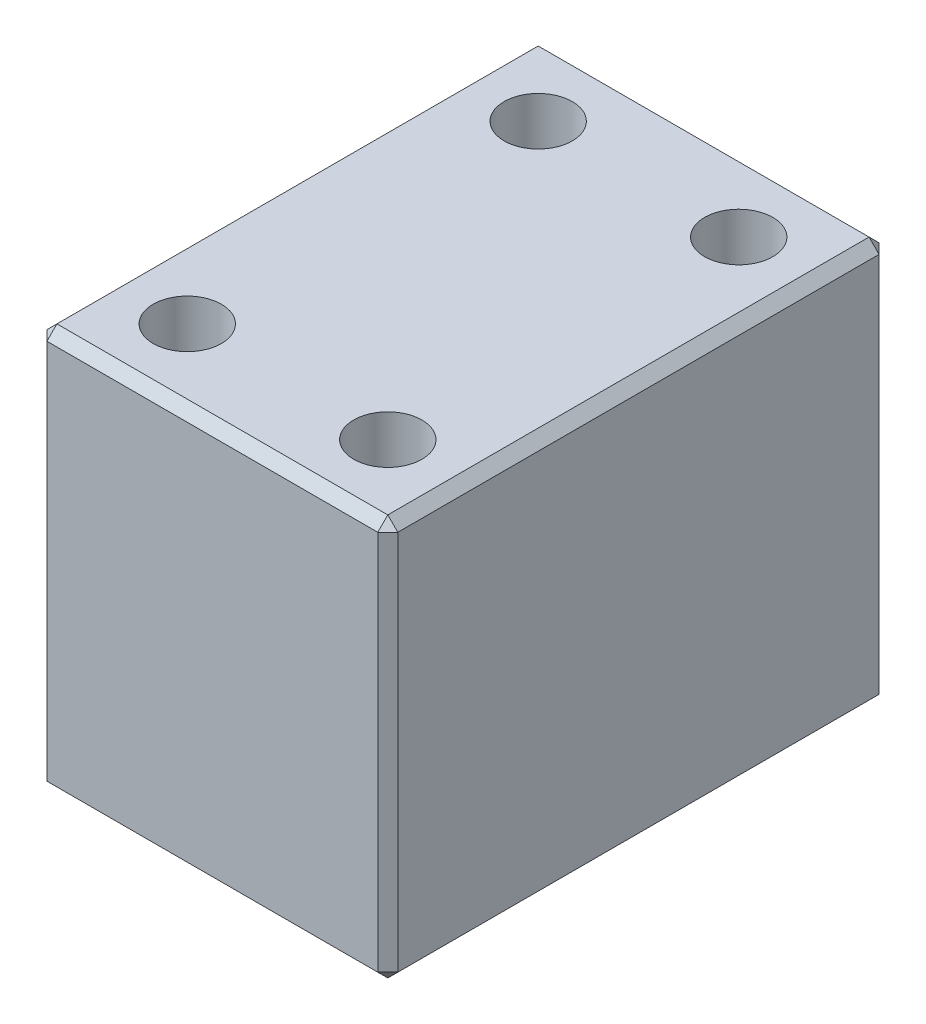
ISO-10303-21;
HEADER;
FILE_DESCRIPTION(('STEP AP214'),'2;1');
FILE_NAME('part.step','',(''),(''),'','','');
FILE_SCHEMA(('AUTOMOTIVE_DESIGN { 1 0 10303 214 1 1 1 1 }'));
ENDSEC;
DATA;
#1=APPLICATION_CONTEXT('core data for automotive mechanical design processes');
#2=APPLICATION_PROTOCOL_DEFINITION('international standard','automotive_design',2000,#1);
#3=PRODUCT_CONTEXT('',#1,'mechanical');
#4=PRODUCT('Part','Part','',(#3));
#5=PRODUCT_RELATED_PRODUCT_CATEGORY('part','',(#4));
#6=PRODUCT_DEFINITION_FORMATION('','',#4);
#7=PRODUCT_DEFINITION_CONTEXT('part definition',#1,'design');
#8=PRODUCT_DEFINITION('design','',#6,#7);
#9=PRODUCT_DEFINITION_SHAPE('','',#8);
#10=(LENGTH_UNIT() NAMED_UNIT(*) SI_UNIT(.MILLI.,.METRE.));
#11=(NAMED_UNIT(*) PLANE_ANGLE_UNIT() SI_UNIT($,.RADIAN.));
#12=(NAMED_UNIT(*) SI_UNIT($,.STERADIAN.) SOLID_ANGLE_UNIT());
#13=UNCERTAINTY_MEASURE_WITH_UNIT(LENGTH_MEASURE(1.E-05),#10,'distance_accuracy_value','');
#14=(GEOMETRIC_REPRESENTATION_CONTEXT(3) GLOBAL_UNCERTAINTY_ASSIGNED_CONTEXT((#13)) GLOBAL_UNIT_ASSIGNED_CONTEXT((#10,
#11,#12)) REPRESENTATION_CONTEXT('',''));
#15=CARTESIAN_POINT('',(0.,0.,0.));
#16=DIRECTION('',(0.,0.,1.));
#17=DIRECTION('',(1.,0.,0.));
#18=AXIS2_PLACEMENT_3D('',#15,#16,#17);
#19=CARTESIAN_POINT('',(17.5,-40.,25.));
#20=DIRECTION('',(1.,0.,0.));
#21=DIRECTION('',(0.,0.,-1.));
#22=AXIS2_PLACEMENT_3D('',#19,#20,#21);
#23=PLANE('',#22);
#24=DIRECTION('',(0.,0.,-1.));
#25=VECTOR('',#24,1.);
#26=CARTESIAN_POINT('',(17.5,-39.,25.));
#27=LINE('',#26,#25);
#28=CARTESIAN_POINT('',(17.5,-39.,24.));
#29=VERTEX_POINT('',#28);
#30=CARTESIAN_POINT('',(17.5,-39.,-24.));
#31=VERTEX_POINT('',#30);
#32=EDGE_CURVE('E63',#29,#31,#27,.T.);
#33=ORIENTED_EDGE('',*,*,#32,.T.);
#34=DIRECTION('',(0.,1.,0.));
#35=VECTOR('',#34,1.);
#36=CARTESIAN_POINT('',(17.5,-40.,-24.));
#37=LINE('',#36,#35);
#38=CARTESIAN_POINT('',(17.5,-1.,-24.));
#39=VERTEX_POINT('',#38);
#40=EDGE_CURVE('E11',#31,#39,#37,.T.);
#41=ORIENTED_EDGE('',*,*,#40,.T.);
#42=DIRECTION('',(0.,0.,1.));
#43=VECTOR('',#42,1.);
#44=CARTESIAN_POINT('',(17.5,-1.,25.));
#45=LINE('',#44,#43);
#46=CARTESIAN_POINT('',(17.5,-1.,24.));
#47=VERTEX_POINT('',#46);
#48=EDGE_CURVE('E232',#39,#47,#45,.T.);
#49=ORIENTED_EDGE('',*,*,#48,.T.);
#50=DIRECTION('',(0.,-1.,0.));
#51=VECTOR('',#50,1.);
#52=CARTESIAN_POINT('',(17.5,-40.,24.));
#53=LINE('',#52,#51);
#54=EDGE_CURVE('E74',#47,#29,#53,.T.);
#55=ORIENTED_EDGE('',*,*,#54,.T.);
#56=EDGE_LOOP('',(#33,#41,#49,#55));
#57=FACE_BOUND('',#56,.T.);
#58=ADVANCED_FACE('F53',(#57),#23,.T.);
#59=CARTESIAN_POINT('',(-17.5,-40.,25.));
#60=DIRECTION('',(0.,0.,1.));
#61=DIRECTION('',(1.,0.,0.));
#62=AXIS2_PLACEMENT_3D('',#59,#60,#61);
#63=PLANE('',#62);
#64=DIRECTION('',(0.,-1.,0.));
#65=VECTOR('',#64,1.);
#66=CARTESIAN_POINT('',(-16.5,-40.,25.));
#67=LINE('',#66,#65);
#68=CARTESIAN_POINT('',(-16.5,-1.,25.));
#69=VERTEX_POINT('',#68);
#70=CARTESIAN_POINT('',(-16.5,-39.,25.));
#71=VERTEX_POINT('',#70);
#72=EDGE_CURVE('E227',#69,#71,#67,.T.);
#73=ORIENTED_EDGE('',*,*,#72,.T.);
#74=DIRECTION('',(1.,0.,0.));
#75=VECTOR('',#74,1.);
#76=CARTESIAN_POINT('',(-17.5,-39.,25.));
#77=LINE('',#76,#75);
#78=CARTESIAN_POINT('',(16.5,-39.,25.));
#79=VERTEX_POINT('',#78);
#80=EDGE_CURVE('E229',#71,#79,#77,.T.);
#81=ORIENTED_EDGE('',*,*,#80,.T.);
#82=DIRECTION('',(0.,1.,0.));
#83=VECTOR('',#82,1.);
#84=CARTESIAN_POINT('',(16.5,-40.,25.));
#85=LINE('',#84,#83);
#86=CARTESIAN_POINT('',(16.5,-1.,25.));
#87=VERTEX_POINT('',#86);
#88=EDGE_CURVE('E223',#79,#87,#85,.T.);
#89=ORIENTED_EDGE('',*,*,#88,.T.);
#90=DIRECTION('',(-1.,0.,0.));
#91=VECTOR('',#90,1.);
#92=CARTESIAN_POINT('',(-17.5,-1.,25.));
#93=LINE('',#92,#91);
#94=EDGE_CURVE('E225',#87,#69,#93,.T.);
#95=ORIENTED_EDGE('',*,*,#94,.T.);
#96=EDGE_LOOP('',(#73,#81,#89,#95));
#97=FACE_BOUND('',#96,.T.);
#98=ADVANCED_FACE('F357',(#97),#63,.T.);
#99=CARTESIAN_POINT('',(-17.5,-40.,25.));
#100=DIRECTION('',(-1.,0.,0.));
#101=DIRECTION('',(0.,0.,1.));
#102=AXIS2_PLACEMENT_3D('',#99,#100,#101);
#103=PLANE('',#102);
#104=DIRECTION('',(0.,-1.,0.));
#105=VECTOR('',#104,1.);
#106=CARTESIAN_POINT('',(-17.5,-40.,-24.));
#107=LINE('',#106,#105);
#108=CARTESIAN_POINT('',(-17.5,-1.,-24.));
#109=VERTEX_POINT('',#108);
#110=CARTESIAN_POINT('',(-17.5,-39.,-24.));
#111=VERTEX_POINT('',#110);
#112=EDGE_CURVE('E218',#109,#111,#107,.T.);
#113=ORIENTED_EDGE('',*,*,#112,.T.);
#114=DIRECTION('',(0.,0.,1.));
#115=VECTOR('',#114,1.);
#116=CARTESIAN_POINT('',(-17.5,-39.,25.));
#117=LINE('',#116,#115);
#118=CARTESIAN_POINT('',(-17.5,-39.,24.));
#119=VERTEX_POINT('',#118);
#120=EDGE_CURVE('E220',#111,#119,#117,.T.);
#121=ORIENTED_EDGE('',*,*,#120,.T.);
#122=DIRECTION('',(0.,1.,0.));
#123=VECTOR('',#122,1.);
#124=CARTESIAN_POINT('',(-17.5,-40.,24.));
#125=LINE('',#124,#123);
#126=CARTESIAN_POINT('',(-17.5,-1.,24.));
#127=VERTEX_POINT('',#126);
#128=EDGE_CURVE('E214',#119,#127,#125,.T.);
#129=ORIENTED_EDGE('',*,*,#128,.T.);
#130=DIRECTION('',(0.,0.,-1.));
#131=VECTOR('',#130,1.);
#132=CARTESIAN_POINT('',(-17.5,-1.,-25.));
#133=LINE('',#132,#131);
#134=EDGE_CURVE('E216',#127,#109,#133,.T.);
#135=ORIENTED_EDGE('',*,*,#134,.T.);
#136=EDGE_LOOP('',(#113,#121,#129,#135));
#137=FACE_BOUND('',#136,.T.);
#138=ADVANCED_FACE('F381',(#137),#103,.T.);
#139=CARTESIAN_POINT('',(-17.5,-40.,-25.));
#140=DIRECTION('',(0.,0.,-1.));
#141=DIRECTION('',(-1.,0.,0.));
#142=AXIS2_PLACEMENT_3D('',#139,#140,#141);
#143=PLANE('',#142);
#144=DIRECTION('',(-1.,0.,0.));
#145=VECTOR('',#144,1.);
#146=CARTESIAN_POINT('',(-17.5,-39.,-25.));
#147=LINE('',#146,#145);
#148=CARTESIAN_POINT('',(16.5,-39.,-25.));
#149=VERTEX_POINT('',#148);
#150=CARTESIAN_POINT('',(-16.5,-39.,-25.));
#151=VERTEX_POINT('',#150);
#152=EDGE_CURVE('E191',#149,#151,#147,.T.);
#153=ORIENTED_EDGE('',*,*,#152,.T.);
#154=DIRECTION('',(0.,1.,0.));
#155=VECTOR('',#154,1.);
#156=CARTESIAN_POINT('',(-16.5,-40.,-25.));
#157=LINE('',#156,#155);
#158=CARTESIAN_POINT('',(-16.5,-1.,-25.));
#159=VERTEX_POINT('',#158);
#160=EDGE_CURVE('E194',#151,#159,#157,.T.);
#161=ORIENTED_EDGE('',*,*,#160,.T.);
#162=DIRECTION('',(1.,0.,0.));
#163=VECTOR('',#162,1.);
#164=CARTESIAN_POINT('',(17.5,-1.,-25.));
#165=LINE('',#164,#163);
#166=CARTESIAN_POINT('',(16.5,-1.,-25.));
#167=VERTEX_POINT('',#166);
#168=EDGE_CURVE('E189',#159,#167,#165,.T.);
#169=ORIENTED_EDGE('',*,*,#168,.T.);
#170=DIRECTION('',(0.,-1.,0.));
#171=VECTOR('',#170,1.);
#172=CARTESIAN_POINT('',(16.5,-40.,-25.));
#173=LINE('',#172,#171);
#174=EDGE_CURVE('E187',#167,#149,#173,.T.);
#175=ORIENTED_EDGE('',*,*,#174,.T.);
#176=EDGE_LOOP('',(#153,#161,#169,#175));
#177=FACE_BOUND('',#176,.T.);
#178=ADVANCED_FACE('F379',(#177),#143,.T.);
#179=CARTESIAN_POINT('',(0.,-40.,0.));
#180=DIRECTION('',(0.,-1.,0.));
#181=DIRECTION('',(0.,0.,-1.));
#182=AXIS2_PLACEMENT_3D('',#179,#180,#181);
#183=PLANE('',#182);
#184=DIRECTION('',(0.,0.,-1.));
#185=VECTOR('',#184,1.);
#186=CARTESIAN_POINT('',(-16.5,-40.,0.));
#187=LINE('',#186,#185);
#188=CARTESIAN_POINT('',(-16.5,-40.,24.));
#189=VERTEX_POINT('',#188);
#190=CARTESIAN_POINT('',(-16.5,-40.,-24.));
#191=VERTEX_POINT('',#190);
#192=EDGE_CURVE('E200',#189,#191,#187,.T.);
#193=ORIENTED_EDGE('',*,*,#192,.T.);
#194=DIRECTION('',(1.,0.,0.));
#195=VECTOR('',#194,1.);
#196=CARTESIAN_POINT('',(0.,-40.,-24.));
#197=LINE('',#196,#195);
#198=CARTESIAN_POINT('',(16.5,-40.,-24.));
#199=VERTEX_POINT('',#198);
#200=EDGE_CURVE('E202',#191,#199,#197,.T.);
#201=ORIENTED_EDGE('',*,*,#200,.T.);
#202=DIRECTION('',(0.,0.,1.));
#203=VECTOR('',#202,1.);
#204=CARTESIAN_POINT('',(16.5,-40.,0.));
#205=LINE('',#204,#203);
#206=CARTESIAN_POINT('',(16.5,-40.,24.));
#207=VERTEX_POINT('',#206);
#208=EDGE_CURVE('E196',#199,#207,#205,.T.);
#209=ORIENTED_EDGE('',*,*,#208,.T.);
#210=DIRECTION('',(-1.,0.,0.));
#211=VECTOR('',#210,1.);
#212=CARTESIAN_POINT('',(0.,-40.,24.));
#213=LINE('',#212,#211);
#214=EDGE_CURVE('E198',#207,#189,#213,.T.);
#215=ORIENTED_EDGE('',*,*,#214,.T.);
#216=EDGE_LOOP('',(#193,#201,#209,#215));
#217=FACE_BOUND('',#216,.T.);
#218=ADVANCED_FACE('F364',(#217),#183,.T.);
#219=CARTESIAN_POINT('',(0.,0.,0.));
#220=DIRECTION('',(0.,-1.,0.));
#221=DIRECTION('',(0.,0.,-1.));
#222=AXIS2_PLACEMENT_3D('',#219,#220,#221);
#223=PLANE('',#222);
#224=CARTESIAN_POINT('',(-10.,0.,17.5));
#225=DIRECTION('',(0.,1.,0.));
#226=DIRECTION('',(0.,0.,1.));
#227=AXIS2_PLACEMENT_3D('',#224,#225,#226);
#228=CIRCLE('',#227,3.39999999999999);
#229=CARTESIAN_POINT('',(-10.,0.,20.9));
#230=VERTEX_POINT('',#229);
#231=EDGE_CURVE('E164',#230,#230,#228,.T.);
#232=ORIENTED_EDGE('',*,*,#231,.F.);
#233=EDGE_LOOP('',(#232));
#234=FACE_BOUND('',#233,.T.);
#235=CARTESIAN_POINT('',(10.,0.,-17.5));
#236=DIRECTION('',(0.,1.,0.));
#237=DIRECTION('',(0.,0.,1.));
#238=AXIS2_PLACEMENT_3D('',#235,#236,#237);
#239=CIRCLE('',#238,3.39999999999999);
#240=CARTESIAN_POINT('',(10.,0.,-14.1));
#241=VERTEX_POINT('',#240);
#242=EDGE_CURVE('E163',#241,#241,#239,.T.);
#243=ORIENTED_EDGE('',*,*,#242,.F.);
#244=EDGE_LOOP('',(#243));
#245=FACE_BOUND('',#244,.T.);
#246=CARTESIAN_POINT('',(-10.,0.,-17.5));
#247=DIRECTION('',(0.,1.,0.));
#248=DIRECTION('',(0.,0.,1.));
#249=AXIS2_PLACEMENT_3D('',#246,#247,#248);
#250=CIRCLE('',#249,3.39999999999999);
#251=CARTESIAN_POINT('',(-10.,0.,-14.1));
#252=VERTEX_POINT('',#251);
#253=EDGE_CURVE('E174',#252,#252,#250,.T.);
#254=ORIENTED_EDGE('',*,*,#253,.F.);
#255=EDGE_LOOP('',(#254));
#256=FACE_BOUND('',#255,.T.);
#257=CARTESIAN_POINT('',(10.,0.,17.5));
#258=DIRECTION('',(0.,1.,0.));
#259=DIRECTION('',(0.,0.,1.));
#260=AXIS2_PLACEMENT_3D('',#257,#258,#259);
#261=CIRCLE('',#260,3.39999999999999);
#262=CARTESIAN_POINT('',(10.,0.,20.9));
#263=VERTEX_POINT('',#262);
#264=EDGE_CURVE('E180',#263,#263,#261,.T.);
#265=ORIENTED_EDGE('',*,*,#264,.F.);
#266=EDGE_LOOP('',(#265));
#267=FACE_BOUND('',#266,.T.);
#268=DIRECTION('',(0.,0.,-1.));
#269=VECTOR('',#268,1.);
#270=CARTESIAN_POINT('',(16.5,0.,-25.));
#271=LINE('',#270,#269);
#272=CARTESIAN_POINT('',(16.5,0.,24.));
#273=VERTEX_POINT('',#272);
#274=CARTESIAN_POINT('',(16.5,0.,-24.));
#275=VERTEX_POINT('',#274);
#276=EDGE_CURVE('E205',#273,#275,#271,.T.);
#277=ORIENTED_EDGE('',*,*,#276,.T.);
#278=DIRECTION('',(-1.,0.,0.));
#279=VECTOR('',#278,1.);
#280=CARTESIAN_POINT('',(-17.5,0.,-24.));
#281=LINE('',#280,#279);
#282=CARTESIAN_POINT('',(-16.5,0.,-24.));
#283=VERTEX_POINT('',#282);
#284=EDGE_CURVE('E211',#275,#283,#281,.T.);
#285=ORIENTED_EDGE('',*,*,#284,.T.);
#286=DIRECTION('',(0.,0.,1.));
#287=VECTOR('',#286,1.);
#288=CARTESIAN_POINT('',(-16.5,0.,25.));
#289=LINE('',#288,#287);
#290=CARTESIAN_POINT('',(-16.5,0.,24.));
#291=VERTEX_POINT('',#290);
#292=EDGE_CURVE('E209',#283,#291,#289,.T.);
#293=ORIENTED_EDGE('',*,*,#292,.T.);
#294=DIRECTION('',(1.,0.,0.));
#295=VECTOR('',#294,1.);
#296=CARTESIAN_POINT('',(17.5,0.,24.));
#297=LINE('',#296,#295);
#298=EDGE_CURVE('E207',#291,#273,#297,.T.);
#299=ORIENTED_EDGE('',*,*,#298,.T.);
#300=EDGE_LOOP('',(#277,#285,#293,#299));
#301=FACE_BOUND('',#300,.T.);
#302=ADVANCED_FACE('F336',(#234,#245,#256,#267,#301),#223,.F.);
#303=CARTESIAN_POINT('',(0.,0.,24.));
#304=DIRECTION('',(0.,0.707106781186545,0.70710678118655));
#305=DIRECTION('',(-1.,0.,0.));
#306=AXIS2_PLACEMENT_3D('',#303,#304,#305);
#307=PLANE('',#306);
#308=DIRECTION('',(0.,-0.70710678118655,0.707106781186545));
#309=VECTOR('',#308,1.);
#310=CARTESIAN_POINT('',(16.5,0.,24.));
#311=LINE('',#310,#309);
#312=EDGE_CURVE('E58',#273,#87,#311,.T.);
#313=ORIENTED_EDGE('',*,*,#312,.F.);
#314=ORIENTED_EDGE('',*,*,#298,.F.);
#315=DIRECTION('',(0.,0.70710678118655,-0.707106781186545));
#316=VECTOR('',#315,1.);
#317=CARTESIAN_POINT('',(-16.5,0.,24.));
#318=LINE('',#317,#316);
#319=EDGE_CURVE('E294',#69,#291,#318,.T.);
#320=ORIENTED_EDGE('',*,*,#319,.F.);
#321=ORIENTED_EDGE('',*,*,#94,.F.);
#322=EDGE_LOOP('',(#313,#314,#320,#321));
#323=FACE_BOUND('',#322,.T.);
#324=ADVANCED_FACE('F56',(#323),#307,.T.);
#325=CARTESIAN_POINT('',(16.5,0.,24.));
#326=DIRECTION('',(0.57735026918963,0.577350269189622,0.577350269189626));
#327=DIRECTION('',(0.707106781186545,0.,-0.70710678118655));
#328=AXIS2_PLACEMENT_3D('',#325,#326,#327);
#329=PLANE('',#328);
#330=DIRECTION('',(-0.707106781186545,0.70710678118655,0.));
#331=VECTOR('',#330,1.);
#332=CARTESIAN_POINT('',(16.5,0.,24.));
#333=LINE('',#332,#331);
#334=EDGE_CURVE('E289',#273,#47,#333,.F.);
#335=ORIENTED_EDGE('',*,*,#334,.F.);
#336=ORIENTED_EDGE('',*,*,#312,.T.);
#337=DIRECTION('',(-0.707106781186545,0.,0.70710678118655));
#338=VECTOR('',#337,1.);
#339=CARTESIAN_POINT('',(17.,-1.,24.5));
#340=LINE('',#339,#338);
#341=EDGE_CURVE('E292',#47,#87,#340,.T.);
#342=ORIENTED_EDGE('',*,*,#341,.F.);
#343=EDGE_LOOP('',(#335,#336,#342));
#344=FACE_BOUND('',#343,.T.);
#345=ADVANCED_FACE('F305',(#344),#329,.T.);
#346=CARTESIAN_POINT('',(-16.5,0.,24.));
#347=DIRECTION('',(-0.577350269189626,0.577350269189622,0.57735026918963));
#348=DIRECTION('',(0.70710678118655,0.,0.707106781186545));
#349=AXIS2_PLACEMENT_3D('',#346,#347,#348);
#350=PLANE('',#349);
#351=DIRECTION('',(-0.70710678118655,0.,-0.707106781186545));
#352=VECTOR('',#351,1.);
#353=CARTESIAN_POINT('',(-17.,-1.,24.5));
#354=LINE('',#353,#352);
#355=EDGE_CURVE('E283',#69,#127,#354,.T.);
#356=ORIENTED_EDGE('',*,*,#355,.F.);
#357=ORIENTED_EDGE('',*,*,#319,.T.);
#358=DIRECTION('',(-0.707106781186545,-0.70710678118655,0.));
#359=VECTOR('',#358,1.);
#360=CARTESIAN_POINT('',(-16.5,0.,24.));
#361=LINE('',#360,#359);
#362=EDGE_CURVE('E286',#127,#291,#361,.F.);
#363=ORIENTED_EDGE('',*,*,#362,.F.);
#364=EDGE_LOOP('',(#356,#357,#363));
#365=FACE_BOUND('',#364,.T.);
#366=ADVANCED_FACE('F350',(#365),#350,.T.);
#367=CARTESIAN_POINT('',(16.5,-40.,25.));
#368=DIRECTION('',(-0.70710678118655,0.,-0.707106781186545));
#369=DIRECTION('',(0.,1.,0.));
#370=AXIS2_PLACEMENT_3D('',#367,#368,#369);
#371=PLANE('',#370);
#372=ORIENTED_EDGE('',*,*,#341,.T.);
#373=ORIENTED_EDGE('',*,*,#88,.F.);
#374=DIRECTION('',(0.707106781186545,0.,-0.70710678118655));
#375=VECTOR('',#374,1.);
#376=CARTESIAN_POINT('',(16.5,-39.,25.));
#377=LINE('',#376,#375);
#378=EDGE_CURVE('E278',#29,#79,#377,.F.);
#379=ORIENTED_EDGE('',*,*,#378,.F.);
#380=ORIENTED_EDGE('',*,*,#54,.F.);
#381=EDGE_LOOP('',(#372,#373,#379,#380));
#382=FACE_BOUND('',#381,.T.);
#383=ADVANCED_FACE('F312',(#382),#371,.F.);
#384=CARTESIAN_POINT('',(16.5,0.,0.));
#385=DIRECTION('',(0.70710678118655,0.707106781186545,0.));
#386=DIRECTION('',(0.,0.,1.));
#387=AXIS2_PLACEMENT_3D('',#384,#385,#386);
#388=PLANE('',#387);
#389=ORIENTED_EDGE('',*,*,#334,.T.);
#390=ORIENTED_EDGE('',*,*,#48,.F.);
#391=DIRECTION('',(0.707106781186545,-0.70710678118655,0.));
#392=VECTOR('',#391,1.);
#393=CARTESIAN_POINT('',(17.,-0.5,-24.));
#394=LINE('',#393,#392);
#395=EDGE_CURVE('E275',#275,#39,#394,.T.);
#396=ORIENTED_EDGE('',*,*,#395,.F.);
#397=ORIENTED_EDGE('',*,*,#276,.F.);
#398=EDGE_LOOP('',(#389,#390,#396,#397));
#399=FACE_BOUND('',#398,.T.);
#400=ADVANCED_FACE('F333',(#399),#388,.T.);
#401=CARTESIAN_POINT('',(0.,0.,-24.));
#402=DIRECTION('',(0.,0.707106781186545,-0.70710678118655));
#403=DIRECTION('',(1.,0.,0.));
#404=AXIS2_PLACEMENT_3D('',#401,#402,#403);
#405=PLANE('',#404);
#406=DIRECTION('',(0.,-0.70710678118655,-0.707106781186545));
#407=VECTOR('',#406,1.);
#408=CARTESIAN_POINT('',(-16.5,0.,-24.));
#409=LINE('',#408,#407);
#410=EDGE_CURVE('E269',#283,#159,#409,.T.);
#411=ORIENTED_EDGE('',*,*,#410,.F.);
#412=ORIENTED_EDGE('',*,*,#284,.F.);
#413=DIRECTION('',(0.,0.70710678118655,0.707106781186545));
#414=VECTOR('',#413,1.);
#415=CARTESIAN_POINT('',(16.5,-1.,-25.));
#416=LINE('',#415,#414);
#417=EDGE_CURVE('E272',#167,#275,#416,.T.);
#418=ORIENTED_EDGE('',*,*,#417,.F.);
#419=ORIENTED_EDGE('',*,*,#168,.F.);
#420=EDGE_LOOP('',(#411,#412,#418,#419));
#421=FACE_BOUND('',#420,.T.);
#422=ADVANCED_FACE('F340',(#421),#405,.T.);
#423=CARTESIAN_POINT('',(-16.5,0.,0.));
#424=DIRECTION('',(-0.70710678118655,0.707106781186545,0.));
#425=DIRECTION('',(0.,0.,-1.));
#426=AXIS2_PLACEMENT_3D('',#423,#424,#425);
#427=PLANE('',#426);
#428=ORIENTED_EDGE('',*,*,#362,.T.);
#429=ORIENTED_EDGE('',*,*,#292,.F.);
#430=DIRECTION('',(0.707106781186545,0.70710678118655,0.));
#431=VECTOR('',#430,1.);
#432=CARTESIAN_POINT('',(-16.5,0.,-24.));
#433=LINE('',#432,#431);
#434=EDGE_CURVE('E267',#109,#283,#433,.T.);
#435=ORIENTED_EDGE('',*,*,#434,.F.);
#436=ORIENTED_EDGE('',*,*,#134,.F.);
#437=EDGE_LOOP('',(#428,#429,#435,#436));
#438=FACE_BOUND('',#437,.T.);
#439=ADVANCED_FACE('F347',(#438),#427,.T.);
#440=CARTESIAN_POINT('',(-17.5,-40.,24.));
#441=DIRECTION('',(0.707106781186545,0.,-0.70710678118655));
#442=DIRECTION('',(0.,1.,0.));
#443=AXIS2_PLACEMENT_3D('',#440,#441,#442);
#444=PLANE('',#443);
#445=ORIENTED_EDGE('',*,*,#355,.T.);
#446=ORIENTED_EDGE('',*,*,#128,.F.);
#447=DIRECTION('',(0.70710678118655,0.,0.707106781186545));
#448=VECTOR('',#447,1.);
#449=CARTESIAN_POINT('',(-17.5,-39.,24.));
#450=LINE('',#449,#448);
#451=EDGE_CURVE('E264',#71,#119,#450,.F.);
#452=ORIENTED_EDGE('',*,*,#451,.F.);
#453=ORIENTED_EDGE('',*,*,#72,.F.);
#454=EDGE_LOOP('',(#445,#446,#452,#453));
#455=FACE_BOUND('',#454,.T.);
#456=ADVANCED_FACE('F354',(#455),#444,.F.);
#457=CARTESIAN_POINT('',(-17.5,-39.,25.));
#458=DIRECTION('',(0.,0.70710678118655,-0.707106781186545));
#459=DIRECTION('',(1.,0.,0.));
#460=AXIS2_PLACEMENT_3D('',#457,#458,#459);
#461=PLANE('',#460);
#462=DIRECTION('',(0.,0.707106781186545,0.70710678118655));
#463=VECTOR('',#462,1.);
#464=CARTESIAN_POINT('',(16.5,-39.,25.));
#465=LINE('',#464,#463);
#466=EDGE_CURVE('E280',#79,#207,#465,.F.);
#467=ORIENTED_EDGE('',*,*,#466,.F.);
#468=ORIENTED_EDGE('',*,*,#80,.F.);
#469=DIRECTION('',(0.,-0.707106781186545,-0.70710678118655));
#470=VECTOR('',#469,1.);
#471=CARTESIAN_POINT('',(-16.5,-39.5,24.5));
#472=LINE('',#471,#470);
#473=EDGE_CURVE('E261',#189,#71,#472,.F.);
#474=ORIENTED_EDGE('',*,*,#473,.F.);
#475=ORIENTED_EDGE('',*,*,#214,.F.);
#476=EDGE_LOOP('',(#467,#468,#474,#475));
#477=FACE_BOUND('',#476,.T.);
#478=ADVANCED_FACE('F360',(#477),#461,.F.);
#479=CARTESIAN_POINT('',(16.5,-39.,25.));
#480=DIRECTION('',(0.57735026918963,-0.577350269189626,0.577350269189622));
#481=DIRECTION('',(0.707106781186545,0.70710678118655,0.));
#482=AXIS2_PLACEMENT_3D('',#479,#480,#481);
#483=PLANE('',#482);
#484=ORIENTED_EDGE('',*,*,#378,.T.);
#485=ORIENTED_EDGE('',*,*,#466,.T.);
#486=DIRECTION('',(-0.707106781186545,-0.70710678118655,0.));
#487=VECTOR('',#486,1.);
#488=CARTESIAN_POINT('',(17.,-39.5,24.));
#489=LINE('',#488,#487);
#490=EDGE_CURVE('E258',#29,#207,#489,.T.);
#491=ORIENTED_EDGE('',*,*,#490,.F.);
#492=EDGE_LOOP('',(#484,#485,#491));
#493=FACE_BOUND('',#492,.T.);
#494=ADVANCED_FACE('F316',(#493),#483,.T.);
#495=CARTESIAN_POINT('',(16.5,-1.,-25.));
#496=DIRECTION('',(0.57735026918963,0.577350269189622,-0.577350269189626));
#497=DIRECTION('',(-0.707106781186545,0.,-0.70710678118655));
#498=AXIS2_PLACEMENT_3D('',#495,#496,#497);
#499=PLANE('',#498);
#500=ORIENTED_EDGE('',*,*,#417,.T.);
#501=ORIENTED_EDGE('',*,*,#395,.T.);
#502=DIRECTION('',(0.707106781186545,0.,0.70710678118655));
#503=VECTOR('',#502,1.);
#504=CARTESIAN_POINT('',(16.5,-1.,-25.));
#505=LINE('',#504,#503);
#506=EDGE_CURVE('E256',#167,#39,#505,.T.);
#507=ORIENTED_EDGE('',*,*,#506,.F.);
#508=EDGE_LOOP('',(#500,#501,#507));
#509=FACE_BOUND('',#508,.T.);
#510=ADVANCED_FACE('F449',(#509),#499,.T.);
#511=CARTESIAN_POINT('',(-16.5,0.,-24.));
#512=DIRECTION('',(-0.57735026918963,0.577350269189622,-0.577350269189626));
#513=DIRECTION('',(-0.707106781186545,0.,0.70710678118655));
#514=AXIS2_PLACEMENT_3D('',#511,#512,#513);
#515=PLANE('',#514);
#516=ORIENTED_EDGE('',*,*,#434,.T.);
#517=ORIENTED_EDGE('',*,*,#410,.T.);
#518=DIRECTION('',(0.707106781186545,0.,-0.70710678118655));
#519=VECTOR('',#518,1.);
#520=CARTESIAN_POINT('',(-17.,-1.,-24.5));
#521=LINE('',#520,#519);
#522=EDGE_CURVE('E253',#109,#159,#521,.T.);
#523=ORIENTED_EDGE('',*,*,#522,.F.);
#524=EDGE_LOOP('',(#516,#517,#523));
#525=FACE_BOUND('',#524,.T.);
#526=ADVANCED_FACE('F442',(#525),#515,.T.);
#527=CARTESIAN_POINT('',(-17.5,-39.,24.));
#528=DIRECTION('',(-0.577350269189622,-0.57735026918963,0.577350269189626));
#529=DIRECTION('',(0.,-0.707106781186545,-0.70710678118655));
#530=AXIS2_PLACEMENT_3D('',#527,#528,#529);
#531=PLANE('',#530);
#532=ORIENTED_EDGE('',*,*,#473,.T.);
#533=ORIENTED_EDGE('',*,*,#451,.T.);
#534=DIRECTION('',(-0.70710678118655,0.707106781186545,0.));
#535=VECTOR('',#534,1.);
#536=CARTESIAN_POINT('',(-17.5,-39.,24.));
#537=LINE('',#536,#535);
#538=EDGE_CURVE('E251',#189,#119,#537,.T.);
#539=ORIENTED_EDGE('',*,*,#538,.F.);
#540=EDGE_LOOP('',(#532,#533,#539));
#541=FACE_BOUND('',#540,.T.);
#542=ADVANCED_FACE('F436',(#541),#531,.T.);
#543=CARTESIAN_POINT('',(17.5,-39.,25.));
#544=DIRECTION('',(-0.70710678118655,0.707106781186545,0.));
#545=DIRECTION('',(0.,0.,-1.));
#546=AXIS2_PLACEMENT_3D('',#543,#544,#545);
#547=PLANE('',#546);
#548=ORIENTED_EDGE('',*,*,#490,.T.);
#549=ORIENTED_EDGE('',*,*,#208,.F.);
#550=DIRECTION('',(0.707106781186545,0.70710678118655,0.));
#551=VECTOR('',#550,1.);
#552=CARTESIAN_POINT('',(16.5,-40.,-24.));
#553=LINE('',#552,#551);
#554=EDGE_CURVE('E248',#31,#199,#553,.F.);
#555=ORIENTED_EDGE('',*,*,#554,.F.);
#556=ORIENTED_EDGE('',*,*,#32,.F.);
#557=EDGE_LOOP('',(#548,#549,#555,#556));
#558=FACE_BOUND('',#557,.T.);
#559=ADVANCED_FACE('F320',(#558),#547,.F.);
#560=CARTESIAN_POINT('',(17.5,-40.,-24.));
#561=DIRECTION('',(-0.70710678118655,0.,0.707106781186545));
#562=DIRECTION('',(0.,1.,0.));
#563=AXIS2_PLACEMENT_3D('',#560,#561,#562);
#564=PLANE('',#563);
#565=ORIENTED_EDGE('',*,*,#506,.T.);
#566=ORIENTED_EDGE('',*,*,#40,.F.);
#567=DIRECTION('',(-0.707106781186545,0.,-0.70710678118655));
#568=VECTOR('',#567,1.);
#569=CARTESIAN_POINT('',(17.,-39.,-24.5));
#570=LINE('',#569,#568);
#571=EDGE_CURVE('E245',#149,#31,#570,.F.);
#572=ORIENTED_EDGE('',*,*,#571,.F.);
#573=ORIENTED_EDGE('',*,*,#174,.F.);
#574=EDGE_LOOP('',(#565,#566,#572,#573));
#575=FACE_BOUND('',#574,.T.);
#576=ADVANCED_FACE('F328',(#575),#564,.F.);
#577=CARTESIAN_POINT('',(-16.5,-40.,-25.));
#578=DIRECTION('',(0.70710678118655,0.,0.707106781186545));
#579=DIRECTION('',(0.,1.,0.));
#580=AXIS2_PLACEMENT_3D('',#577,#578,#579);
#581=PLANE('',#580);
#582=ORIENTED_EDGE('',*,*,#522,.T.);
#583=ORIENTED_EDGE('',*,*,#160,.F.);
#584=DIRECTION('',(-0.707106781186545,0.,0.70710678118655));
#585=VECTOR('',#584,1.);
#586=CARTESIAN_POINT('',(-16.5,-39.,-25.));
#587=LINE('',#586,#585);
#588=EDGE_CURVE('E242',#111,#151,#587,.F.);
#589=ORIENTED_EDGE('',*,*,#588,.F.);
#590=ORIENTED_EDGE('',*,*,#112,.F.);
#591=EDGE_LOOP('',(#582,#583,#589,#590));
#592=FACE_BOUND('',#591,.T.);
#593=ADVANCED_FACE('F377',(#592),#581,.F.);
#594=CARTESIAN_POINT('',(-17.5,-39.,25.));
#595=DIRECTION('',(0.707106781186545,0.70710678118655,0.));
#596=DIRECTION('',(0.,0.,1.));
#597=AXIS2_PLACEMENT_3D('',#594,#595,#596);
#598=PLANE('',#597);
#599=ORIENTED_EDGE('',*,*,#538,.T.);
#600=ORIENTED_EDGE('',*,*,#120,.F.);
#601=DIRECTION('',(0.70710678118655,-0.707106781186545,0.));
#602=VECTOR('',#601,1.);
#603=CARTESIAN_POINT('',(-17.,-39.5,-24.));
#604=LINE('',#603,#602);
#605=EDGE_CURVE('E239',#191,#111,#604,.F.);
#606=ORIENTED_EDGE('',*,*,#605,.F.);
#607=ORIENTED_EDGE('',*,*,#192,.F.);
#608=EDGE_LOOP('',(#599,#600,#606,#607));
#609=FACE_BOUND('',#608,.T.);
#610=ADVANCED_FACE('F414',(#609),#598,.F.);
#611=CARTESIAN_POINT('',(16.5,-40.,-24.));
#612=DIRECTION('',(0.57735026918963,-0.577350269189626,-0.577350269189622));
#613=DIRECTION('',(0.707106781186545,0.70710678118655,0.));
#614=AXIS2_PLACEMENT_3D('',#611,#612,#613);
#615=PLANE('',#614);
#616=ORIENTED_EDGE('',*,*,#571,.T.);
#617=ORIENTED_EDGE('',*,*,#554,.T.);
#618=DIRECTION('',(0.,-0.707106781186545,0.70710678118655));
#619=VECTOR('',#618,1.);
#620=CARTESIAN_POINT('',(16.5,-40.,-24.));
#621=LINE('',#620,#619);
#622=EDGE_CURVE('E237',#149,#199,#621,.T.);
#623=ORIENTED_EDGE('',*,*,#622,.F.);
#624=EDGE_LOOP('',(#616,#617,#623));
#625=FACE_BOUND('',#624,.T.);
#626=ADVANCED_FACE('F324',(#625),#615,.T.);
#627=CARTESIAN_POINT('',(-16.5,-39.,-25.));
#628=DIRECTION('',(-0.577350269189626,-0.57735026918963,-0.577350269189622));
#629=DIRECTION('',(0.70710678118655,-0.707106781186545,0.));
#630=AXIS2_PLACEMENT_3D('',#627,#628,#629);
#631=PLANE('',#630);
#632=ORIENTED_EDGE('',*,*,#605,.T.);
#633=ORIENTED_EDGE('',*,*,#588,.T.);
#634=DIRECTION('',(0.,0.707106781186545,-0.70710678118655));
#635=VECTOR('',#634,1.);
#636=CARTESIAN_POINT('',(-16.5,-39.,-25.));
#637=LINE('',#636,#635);
#638=EDGE_CURVE('E186',#191,#151,#637,.T.);
#639=ORIENTED_EDGE('',*,*,#638,.F.);
#640=EDGE_LOOP('',(#632,#633,#639));
#641=FACE_BOUND('',#640,.T.);
#642=ADVANCED_FACE('F372',(#641),#631,.T.);
#643=CARTESIAN_POINT('',(-17.5,-39.,-25.));
#644=DIRECTION('',(0.,0.70710678118655,0.707106781186545));
#645=DIRECTION('',(-1.,0.,0.));
#646=AXIS2_PLACEMENT_3D('',#643,#644,#645);
#647=PLANE('',#646);
#648=ORIENTED_EDGE('',*,*,#622,.T.);
#649=ORIENTED_EDGE('',*,*,#200,.F.);
#650=ORIENTED_EDGE('',*,*,#638,.T.);
#651=ORIENTED_EDGE('',*,*,#152,.F.);
#652=EDGE_LOOP('',(#648,#649,#650,#651));
#653=FACE_BOUND('',#652,.T.);
#654=ADVANCED_FACE('F370',(#653),#647,.F.);
#655=CARTESIAN_POINT('',(10.,-19.75,17.5));
#656=DIRECTION('',(0.,1.,0.));
#657=DIRECTION('',(0.,0.,1.));
#658=AXIS2_PLACEMENT_3D('',#655,#656,#657);
#659=CONICAL_SURFACE('',#658,3.39999999999999,1.02974425867665);
#660=CARTESIAN_POINT('',(10.,-21.7929261046937,17.5));
#661=VERTEX_POINT('',#660);
#662=VERTEX_LOOP('',#661);
#663=FACE_BOUND('',#662,.T.);
#664=CARTESIAN_POINT('',(10.,-19.75,17.5));
#665=DIRECTION('',(0.,1.,0.));
#666=DIRECTION('',(0.,0.,1.));
#667=AXIS2_PLACEMENT_3D('',#664,#665,#666);
#668=CIRCLE('',#667,3.39999999999999);
#669=CARTESIAN_POINT('',(10.,-19.75,20.9));
#670=VERTEX_POINT('',#669);
#671=EDGE_CURVE('E183',#670,#670,#668,.T.);
#672=ORIENTED_EDGE('',*,*,#671,.T.);
#673=EDGE_LOOP('',(#672));
#674=FACE_BOUND('',#673,.T.);
#675=ADVANCED_FACE('F403',(#663,#674),#659,.F.);
#676=CARTESIAN_POINT('',(10.,0.,17.5));
#677=DIRECTION('',(0.,1.,0.));
#678=DIRECTION('',(0.,0.,1.));
#679=AXIS2_PLACEMENT_3D('',#676,#677,#678);
#680=CYLINDRICAL_SURFACE('',#679,3.39999999999999);
#681=ORIENTED_EDGE('',*,*,#671,.F.);
#682=EDGE_LOOP('',(#681));
#683=FACE_BOUND('',#682,.T.);
#684=ORIENTED_EDGE('',*,*,#264,.T.);
#685=EDGE_LOOP('',(#684));
#686=FACE_BOUND('',#685,.T.);
#687=ADVANCED_FACE('F515',(#683,#686),#680,.F.);
#688=CARTESIAN_POINT('',(-10.,-19.75,-17.5));
#689=DIRECTION('',(0.,1.,0.));
#690=DIRECTION('',(0.,0.,1.));
#691=AXIS2_PLACEMENT_3D('',#688,#689,#690);
#692=CONICAL_SURFACE('',#691,3.39999999999999,1.02974425867665);
#693=CARTESIAN_POINT('',(-10.,-21.7929261046937,-17.5));
#694=VERTEX_POINT('',#693);
#695=VERTEX_LOOP('',#694);
#696=FACE_BOUND('',#695,.T.);
#697=CARTESIAN_POINT('',(-10.,-19.75,-17.5));
#698=DIRECTION('',(0.,1.,0.));
#699=DIRECTION('',(0.,0.,1.));
#700=AXIS2_PLACEMENT_3D('',#697,#698,#699);
#701=CIRCLE('',#700,3.39999999999999);
#702=CARTESIAN_POINT('',(-10.,-19.75,-14.1));
#703=VERTEX_POINT('',#702);
#704=EDGE_CURVE('E177',#703,#703,#701,.T.);
#705=ORIENTED_EDGE('',*,*,#704,.T.);
#706=EDGE_LOOP('',(#705));
#707=FACE_BOUND('',#706,.T.);
#708=ADVANCED_FACE('F519',(#696,#707),#692,.F.);
#709=CARTESIAN_POINT('',(-10.,0.,-17.5));
#710=DIRECTION('',(0.,1.,0.));
#711=DIRECTION('',(0.,0.,1.));
#712=AXIS2_PLACEMENT_3D('',#709,#710,#711);
#713=CYLINDRICAL_SURFACE('',#712,3.39999999999999);
#714=ORIENTED_EDGE('',*,*,#704,.F.);
#715=EDGE_LOOP('',(#714));
#716=FACE_BOUND('',#715,.T.);
#717=ORIENTED_EDGE('',*,*,#253,.T.);
#718=EDGE_LOOP('',(#717));
#719=FACE_BOUND('',#718,.T.);
#720=ADVANCED_FACE('F523',(#716,#719),#713,.F.);
#721=CARTESIAN_POINT('',(10.,-19.75,-17.5));
#722=DIRECTION('',(0.,1.,0.));
#723=DIRECTION('',(0.,0.,1.));
#724=AXIS2_PLACEMENT_3D('',#721,#722,#723);
#725=CONICAL_SURFACE('',#724,3.39999999999999,1.02974425867665);
#726=CARTESIAN_POINT('',(10.,-21.7929261046937,-17.5));
#727=VERTEX_POINT('',#726);
#728=VERTEX_LOOP('',#727);
#729=FACE_BOUND('',#728,.T.);
#730=CARTESIAN_POINT('',(10.,-19.75,-17.5));
#731=DIRECTION('',(0.,1.,0.));
#732=DIRECTION('',(0.,0.,1.));
#733=AXIS2_PLACEMENT_3D('',#730,#731,#732);
#734=CIRCLE('',#733,3.39999999999999);
#735=CARTESIAN_POINT('',(10.,-19.75,-14.1));
#736=VERTEX_POINT('',#735);
#737=EDGE_CURVE('E167',#736,#736,#734,.T.);
#738=ORIENTED_EDGE('',*,*,#737,.T.);
#739=EDGE_LOOP('',(#738));
#740=FACE_BOUND('',#739,.T.);
#741=ADVANCED_FACE('F527',(#729,#740),#725,.F.);
#742=CARTESIAN_POINT('',(10.,0.,-17.5));
#743=DIRECTION('',(0.,1.,0.));
#744=DIRECTION('',(0.,0.,1.));
#745=AXIS2_PLACEMENT_3D('',#742,#743,#744);
#746=CYLINDRICAL_SURFACE('',#745,3.39999999999999);
#747=ORIENTED_EDGE('',*,*,#737,.F.);
#748=EDGE_LOOP('',(#747));
#749=FACE_BOUND('',#748,.T.);
#750=ORIENTED_EDGE('',*,*,#242,.T.);
#751=EDGE_LOOP('',(#750));
#752=FACE_BOUND('',#751,.T.);
#753=ADVANCED_FACE('F157',(#749,#752),#746,.F.);
#754=CARTESIAN_POINT('',(-10.,-19.75,17.5));
#755=DIRECTION('',(0.,1.,0.));
#756=DIRECTION('',(0.,0.,1.));
#757=AXIS2_PLACEMENT_3D('',#754,#755,#756);
#758=CONICAL_SURFACE('',#757,3.39999999999999,1.02974425867665);
#759=CARTESIAN_POINT('',(-10.,-21.7929261046937,17.5));
#760=VERTEX_POINT('',#759);
#761=VERTEX_LOOP('',#760);
#762=FACE_BOUND('',#761,.T.);
#763=CARTESIAN_POINT('',(-10.,-19.75,17.5));
#764=DIRECTION('',(0.,1.,0.));
#765=DIRECTION('',(0.,0.,1.));
#766=AXIS2_PLACEMENT_3D('',#763,#764,#765);
#767=CIRCLE('',#766,3.39999999999999);
#768=CARTESIAN_POINT('',(-10.,-19.75,20.9));
#769=VERTEX_POINT('',#768);
#770=EDGE_CURVE('E161',#769,#769,#767,.T.);
#771=ORIENTED_EDGE('',*,*,#770,.T.);
#772=EDGE_LOOP('',(#771));
#773=FACE_BOUND('',#772,.T.);
#774=ADVANCED_FACE('F153',(#762,#773),#758,.F.);
#775=CARTESIAN_POINT('',(-10.,0.,17.5));
#776=DIRECTION('',(0.,1.,0.));
#777=DIRECTION('',(0.,0.,1.));
#778=AXIS2_PLACEMENT_3D('',#775,#776,#777);
#779=CYLINDRICAL_SURFACE('',#778,3.39999999999999);
#780=ORIENTED_EDGE('',*,*,#770,.F.);
#781=EDGE_LOOP('',(#780));
#782=FACE_BOUND('',#781,.T.);
#783=ORIENTED_EDGE('',*,*,#231,.T.);
#784=EDGE_LOOP('',(#783));
#785=FACE_BOUND('',#784,.T.);
#786=ADVANCED_FACE('F156',(#782,#785),#779,.F.);
#787=CLOSED_SHELL('',(#58,#98,#138,#178,#218,#302,#324,#345,#366,#383,#400,#422,#439,#456,#478,
#494,#510,#526,#542,#559,#576,#593,#610,#626,#642,#654,#675,#687,#708,#720,#741,#753,#774,#786));
#788=MANIFOLD_SOLID_BREP('B2',#787);
#789=ADVANCED_BREP_SHAPE_REPRESENTATION('',(#18,#788),#14);
#790=SHAPE_DEFINITION_REPRESENTATION(#9,#789);
ENDSEC;
END-ISO-10303-21;
